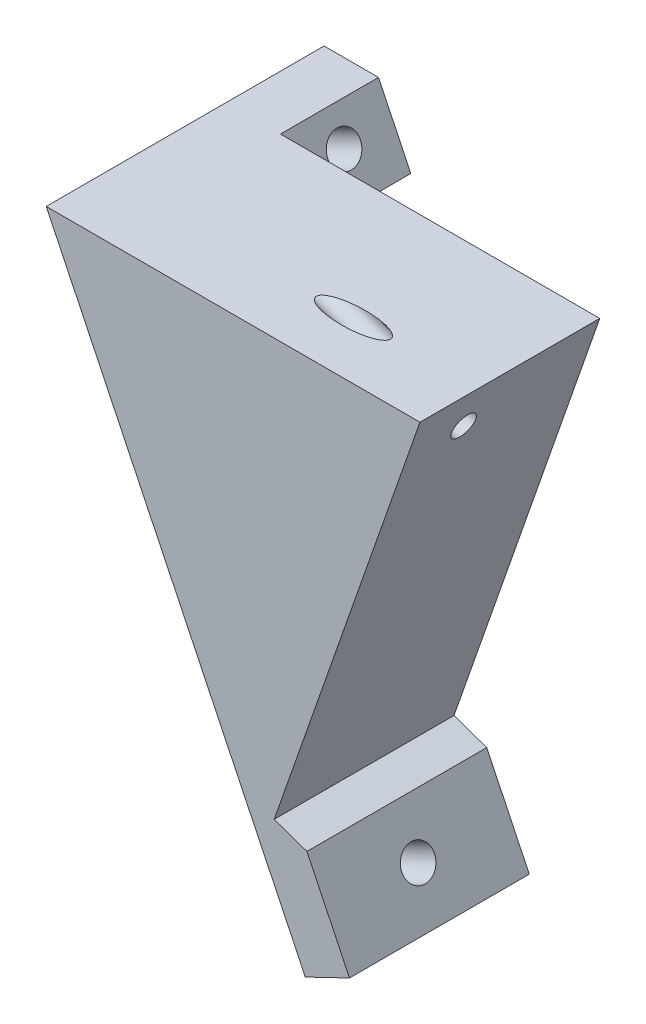
ISO-10303-21;
HEADER;
FILE_DESCRIPTION(('STEP AP214'),'2;1');
FILE_NAME('part.step','',(''),(''),'','','');
FILE_SCHEMA(('AUTOMOTIVE_DESIGN { 1 0 10303 214 1 1 1 1 }'));
ENDSEC;
DATA;
#1=APPLICATION_CONTEXT('core data for automotive mechanical design processes');
#2=APPLICATION_PROTOCOL_DEFINITION('international standard','automotive_design',2000,#1);
#3=PRODUCT_CONTEXT('',#1,'mechanical');
#4=PRODUCT('Part','Part','',(#3));
#5=PRODUCT_RELATED_PRODUCT_CATEGORY('part','',(#4));
#6=PRODUCT_DEFINITION_FORMATION('','',#4);
#7=PRODUCT_DEFINITION_CONTEXT('part definition',#1,'design');
#8=PRODUCT_DEFINITION('design','',#6,#7);
#9=PRODUCT_DEFINITION_SHAPE('','',#8);
#10=(LENGTH_UNIT() NAMED_UNIT(*) SI_UNIT(.MILLI.,.METRE.));
#11=(NAMED_UNIT(*) PLANE_ANGLE_UNIT() SI_UNIT($,.RADIAN.));
#12=(NAMED_UNIT(*) SI_UNIT($,.STERADIAN.) SOLID_ANGLE_UNIT());
#13=UNCERTAINTY_MEASURE_WITH_UNIT(LENGTH_MEASURE(1.E-05),#10,'distance_accuracy_value','');
#14=(GEOMETRIC_REPRESENTATION_CONTEXT(3) GLOBAL_UNCERTAINTY_ASSIGNED_CONTEXT((#13)) GLOBAL_UNIT_ASSIGNED_CONTEXT((#10,
#11,#12)) REPRESENTATION_CONTEXT('',''));
#15=CARTESIAN_POINT('',(0.,0.,0.));
#16=DIRECTION('',(0.,0.,1.));
#17=DIRECTION('',(1.,0.,0.));
#18=AXIS2_PLACEMENT_3D('',#15,#16,#17);
#19=CARTESIAN_POINT('',(9.49412369630558,24.241346542851,22.));
#20=DIRECTION('',(0.,-1.,0.));
#21=DIRECTION('',(0.,0.,-1.));
#22=AXIS2_PLACEMENT_3D('',#19,#20,#21);
#23=PLANE('',#22);
#24=CARTESIAN_POINT('',(-5.65051296153795,24.241346542851,15.));
#25=DIRECTION('',(0.,-1.,0.));
#26=DIRECTION('',(1.,0.,0.));
#27=AXIS2_PLACEMENT_3D('',#24,#25,#26);
#28=ELLIPSE('',#27,4.54339099735307,1.5);
#29=CARTESIAN_POINT('',(-1.10712196418488,24.241346542851,15.));
#30=VERTEX_POINT('',#29);
#31=EDGE_CURVE('E188',#30,#30,#28,.T.);
#32=ORIENTED_EDGE('',*,*,#31,.T.);
#33=EDGE_LOOP('',(#32));
#34=FACE_BOUND('',#33,.T.);
#35=DIRECTION('',(-1.,0.,0.));
#36=VECTOR('',#35,1.);
#37=CARTESIAN_POINT('',(9.49412369630558,24.241346542851,0.));
#38=LINE('',#37,#36);
#39=CARTESIAN_POINT('',(9.49412369630558,24.241346542851,0.));
#40=VERTEX_POINT('',#39);
#41=CARTESIAN_POINT('',(-29.578701160511,24.241346542851,0.));
#42=VERTEX_POINT('',#41);
#43=EDGE_CURVE('E135',#40,#42,#38,.T.);
#44=ORIENTED_EDGE('',*,*,#43,.T.);
#45=DIRECTION('',(0.,0.,-1.));
#46=VECTOR('',#45,1.);
#47=CARTESIAN_POINT('',(-29.578701160511,24.241346542851,0.));
#48=LINE('',#47,#46);
#49=CARTESIAN_POINT('',(-29.578701160511,24.241346542851,-12.));
#50=VERTEX_POINT('',#49);
#51=EDGE_CURVE('E11',#42,#50,#48,.T.);
#52=ORIENTED_EDGE('',*,*,#51,.T.);
#53=DIRECTION('',(-1.,0.,0.));
#54=VECTOR('',#53,1.);
#55=CARTESIAN_POINT('',(-30.8331808679364,24.241346542851,-12.));
#56=LINE('',#55,#54);
#57=CARTESIAN_POINT('',(-36.2386377440524,24.241346542851,-12.));
#58=VERTEX_POINT('',#57);
#59=EDGE_CURVE('E114',#50,#58,#56,.T.);
#60=ORIENTED_EDGE('',*,*,#59,.T.);
#61=DIRECTION('',(0.,0.,-1.));
#62=VECTOR('',#61,1.);
#63=CARTESIAN_POINT('',(-36.2386377440524,24.241346542851,22.));
#64=LINE('',#63,#62);
#65=CARTESIAN_POINT('',(-36.2386377440524,24.241346542851,22.));
#66=VERTEX_POINT('',#65);
#67=EDGE_CURVE('E40',#66,#58,#64,.T.);
#68=ORIENTED_EDGE('',*,*,#67,.F.);
#69=DIRECTION('',(-1.,0.,0.));
#70=VECTOR('',#69,1.);
#71=CARTESIAN_POINT('',(9.49412369630558,24.241346542851,22.));
#72=LINE('',#71,#70);
#73=CARTESIAN_POINT('',(9.49412369630558,24.241346542851,22.));
#74=VERTEX_POINT('',#73);
#75=EDGE_CURVE('E137',#74,#66,#72,.T.);
#76=ORIENTED_EDGE('',*,*,#75,.F.);
#77=DIRECTION('',(0.,0.,-1.));
#78=VECTOR('',#77,1.);
#79=CARTESIAN_POINT('',(9.49412369630558,24.241346542851,22.));
#80=LINE('',#79,#78);
#81=EDGE_CURVE('E112',#74,#40,#80,.T.);
#82=ORIENTED_EDGE('',*,*,#81,.T.);
#83=EDGE_LOOP('',(#44,#52,#60,#68,#76,#82));
#84=FACE_BOUND('',#83,.T.);
#85=ADVANCED_FACE('F33',(#34,#84),#23,.F.);
#86=CARTESIAN_POINT('',(-36.2386377440524,24.241346542851,22.));
#87=DIRECTION('',(0.900909479352666,0.434007039127834,0.));
#88=DIRECTION('',(-0.434007039127834,0.900909479352666,0.));
#89=AXIS2_PLACEMENT_3D('',#86,#87,#88);
#90=PLANE('',#89);
#91=CARTESIAN_POINT('',(-33.2005884701575,17.9349801873824,-6.));
#92=DIRECTION('',(0.900909479352665,0.434007039127834,0.));
#93=DIRECTION('',(-0.434007039127834,0.900909479352665,0.));
#94=AXIS2_PLACEMENT_3D('',#91,#92,#93);
#95=CIRCLE('',#94,2.);
#96=CARTESIAN_POINT('',(-34.0686025484132,19.7367991460877,-6.));
#97=VERTEX_POINT('',#96);
#98=EDGE_CURVE('E176',#97,#97,#95,.T.);
#99=ORIENTED_EDGE('',*,*,#98,.T.);
#100=EDGE_LOOP('',(#99));
#101=FACE_BOUND('',#100,.T.);
#102=CARTESIAN_POINT('',(-7.13871806643441,-36.164110333265,11.));
#103=DIRECTION('',(0.900909479352665,0.434007039127834,0.));
#104=DIRECTION('',(-0.434007039127834,0.900909479352665,0.));
#105=AXIS2_PLACEMENT_3D('',#102,#103,#104);
#106=CIRCLE('',#105,2.);
#107=CARTESIAN_POINT('',(-8.00673214469008,-34.3622913745596,11.));
#108=VERTEX_POINT('',#107);
#109=EDGE_CURVE('E187',#108,#108,#106,.T.);
#110=ORIENTED_EDGE('',*,*,#109,.T.);
#111=EDGE_LOOP('',(#110));
#112=FACE_BOUND('',#111,.T.);
#113=ORIENTED_EDGE('',*,*,#67,.T.);
#114=DIRECTION('',(0.434007039127834,-0.900909479352665,0.));
#115=VECTOR('',#114,1.);
#116=CARTESIAN_POINT('',(-36.2386377440524,24.241346542851,-12.));
#117=LINE('',#116,#115);
#118=CARTESIAN_POINT('',(-31.0305532745184,13.4304327906191,-12.));
#119=VERTEX_POINT('',#118);
#120=EDGE_CURVE('E105',#58,#119,#117,.T.);
#121=ORIENTED_EDGE('',*,*,#120,.T.);
#122=DIRECTION('',(0.,0.,1.));
#123=VECTOR('',#122,1.);
#124=CARTESIAN_POINT('',(-31.0305532745184,13.4304327906191,0.));
#125=LINE('',#124,#123);
#126=CARTESIAN_POINT('',(-31.0305532745184,13.4304327906191,0.));
#127=VERTEX_POINT('',#126);
#128=EDGE_CURVE('E122',#119,#127,#125,.T.);
#129=ORIENTED_EDGE('',*,*,#128,.T.);
#130=DIRECTION('',(0.434007039127834,-0.900909479352665,0.));
#131=VECTOR('',#130,1.);
#132=CARTESIAN_POINT('',(-36.2386377440524,24.241346542851,0.));
#133=LINE('',#132,#131);
#134=CARTESIAN_POINT('',(-4.53467583166741,-41.5695672093809,0.));
#135=VERTEX_POINT('',#134);
#136=EDGE_CURVE('E144',#127,#135,#133,.T.);
#137=ORIENTED_EDGE('',*,*,#136,.T.);
#138=DIRECTION('',(0.,0.,1.));
#139=VECTOR('',#138,1.);
#140=CARTESIAN_POINT('',(-4.53467583166741,-41.5695672093809,0.));
#141=LINE('',#140,#139);
#142=CARTESIAN_POINT('',(-4.53467583166741,-41.5695672093809,22.));
#143=VERTEX_POINT('',#142);
#144=EDGE_CURVE('E173',#135,#143,#141,.T.);
#145=ORIENTED_EDGE('',*,*,#144,.T.);
#146=DIRECTION('',(0.434007039127834,-0.900909479352665,0.));
#147=VECTOR('',#146,1.);
#148=CARTESIAN_POINT('',(-36.2386377440524,24.241346542851,22.));
#149=LINE('',#148,#147);
#150=EDGE_CURVE('E108',#66,#143,#149,.T.);
#151=ORIENTED_EDGE('',*,*,#150,.F.);
#152=EDGE_LOOP('',(#113,#121,#129,#137,#145,#151));
#153=FACE_BOUND('',#152,.T.);
#154=ADVANCED_FACE('F102',(#101,#112,#153),#90,.F.);
#155=CARTESIAN_POINT('',(-9.74276030120141,-30.758653457149,22.));
#156=DIRECTION('',(-0.9439285225355,0.33014988163552,0.));
#157=DIRECTION('',(-0.33014988163552,-0.9439285225355,0.));
#158=AXIS2_PLACEMENT_3D('',#155,#156,#157);
#159=PLANE('',#158);
#160=CARTESIAN_POINT('',(7.84337428812798,19.5217039301735,15.));
#161=DIRECTION('',(0.9439285225355,-0.33014988163552,0.));
#162=DIRECTION('',(0.33014988163552,0.9439285225355,0.));
#163=AXIS2_PLACEMENT_3D('',#160,#161,#162);
#164=CIRCLE('',#163,1.5);
#165=CARTESIAN_POINT('',(8.33859911058126,20.9375967139768,15.));
#166=VERTEX_POINT('',#165);
#167=EDGE_CURVE('E117',#166,#166,#164,.T.);
#168=ORIENTED_EDGE('',*,*,#167,.F.);
#169=EDGE_LOOP('',(#168));
#170=FACE_BOUND('',#169,.T.);
#171=DIRECTION('',(0.33014988163552,0.9439285225355,0.));
#172=VECTOR('',#171,1.);
#173=CARTESIAN_POINT('',(-9.74276030120141,-30.758653457149,22.));
#174=LINE('',#173,#172);
#175=CARTESIAN_POINT('',(-8.34308333133661,-26.7568497683322,22.));
#176=VERTEX_POINT('',#175);
#177=EDGE_CURVE('E141',#176,#74,#174,.T.);
#178=ORIENTED_EDGE('',*,*,#177,.F.);
#179=DIRECTION('',(0.,0.,-1.));
#180=VECTOR('',#179,1.);
#181=CARTESIAN_POINT('',(-8.34308333133661,-26.7568497683322,22.));
#182=LINE('',#181,#180);
#183=CARTESIAN_POINT('',(-8.34308333133661,-26.7568497683322,0.));
#184=VERTEX_POINT('',#183);
#185=EDGE_CURVE('E127',#176,#184,#182,.T.);
#186=ORIENTED_EDGE('',*,*,#185,.T.);
#187=DIRECTION('',(0.33014988163552,0.9439285225355,0.));
#188=VECTOR('',#187,1.);
#189=CARTESIAN_POINT('',(-9.74276030120141,-30.758653457149,0.));
#190=LINE('',#189,#188);
#191=EDGE_CURVE('E139',#184,#40,#190,.T.);
#192=ORIENTED_EDGE('',*,*,#191,.T.);
#193=ORIENTED_EDGE('',*,*,#81,.F.);
#194=EDGE_LOOP('',(#178,#186,#192,#193));
#195=FACE_BOUND('',#194,.T.);
#196=ADVANCED_FACE('F204',(#170,#195),#159,.F.);
#197=CARTESIAN_POINT('',(0.,0.,22.));
#198=DIRECTION('',(0.,0.,-1.));
#199=DIRECTION('',(-1.,0.,0.));
#200=AXIS2_PLACEMENT_3D('',#197,#198,#199);
#201=PLANE('',#200);
#202=ORIENTED_EDGE('',*,*,#75,.T.);
#203=ORIENTED_EDGE('',*,*,#150,.T.);
#204=DIRECTION('',(-0.900909479352665,-0.434007039127834,0.));
#205=VECTOR('',#204,1.);
#206=CARTESIAN_POINT('',(0.870781044448587,-38.9655249746139,22.));
#207=LINE('',#206,#205);
#208=CARTESIAN_POINT('',(0.870781044448587,-38.9655249746139,22.));
#209=VERTEX_POINT('',#208);
#210=EDGE_CURVE('E165',#209,#143,#207,.T.);
#211=ORIENTED_EDGE('',*,*,#210,.F.);
#212=DIRECTION('',(-0.434007039127834,0.900909479352665,0.));
#213=VECTOR('',#212,1.);
#214=CARTESIAN_POINT('',(-4.33730342508542,-28.154611222382,22.));
#215=LINE('',#214,#213);
#216=CARTESIAN_POINT('',(-4.33730342508542,-28.154611222382,22.));
#217=VERTEX_POINT('',#216);
#218=EDGE_CURVE('E170',#209,#217,#215,.T.);
#219=ORIENTED_EDGE('',*,*,#218,.T.);
#220=DIRECTION('',(0.944171123106107,-0.329455445079532,0.));
#221=VECTOR('',#220,1.);
#222=CARTESIAN_POINT('',(-4.33730342508542,-28.154611222382,22.));
#223=LINE('',#222,#221);
#224=EDGE_CURVE('E162',#176,#217,#223,.T.);
#225=ORIENTED_EDGE('',*,*,#224,.F.);
#226=ORIENTED_EDGE('',*,*,#177,.T.);
#227=EDGE_LOOP('',(#202,#203,#211,#219,#225,#226));
#228=FACE_BOUND('',#227,.T.);
#229=ADVANCED_FACE('F206',(#228),#201,.F.);
#230=CARTESIAN_POINT('',(0.,0.,0.));
#231=DIRECTION('',(0.,0.,-1.));
#232=DIRECTION('',(-1.,0.,0.));
#233=AXIS2_PLACEMENT_3D('',#230,#231,#232);
#234=PLANE('',#233);
#235=DIRECTION('',(-0.900909479352665,-0.434007039127834,0.));
#236=VECTOR('',#235,1.);
#237=CARTESIAN_POINT('',(-25.6250963984024,16.0344750253861,0.));
#238=LINE('',#237,#236);
#239=CARTESIAN_POINT('',(-25.6250963984024,16.0344750253861,0.));
#240=VERTEX_POINT('',#239);
#241=EDGE_CURVE('E133',#240,#127,#238,.T.);
#242=ORIENTED_EDGE('',*,*,#241,.F.);
#243=DIRECTION('',(-0.434007039127834,0.900909479352665,0.));
#244=VECTOR('',#243,1.);
#245=CARTESIAN_POINT('',(-30.8331808679364,26.8453887776181,0.));
#246=LINE('',#245,#244);
#247=EDGE_CURVE('E125',#240,#42,#246,.T.);
#248=ORIENTED_EDGE('',*,*,#247,.T.);
#249=ORIENTED_EDGE('',*,*,#43,.F.);
#250=ORIENTED_EDGE('',*,*,#191,.F.);
#251=DIRECTION('',(0.944171123106107,-0.329455445079532,0.));
#252=VECTOR('',#251,1.);
#253=CARTESIAN_POINT('',(-4.33730342508542,-28.154611222382,0.));
#254=LINE('',#253,#252);
#255=CARTESIAN_POINT('',(-4.33730342508542,-28.154611222382,0.));
#256=VERTEX_POINT('',#255);
#257=EDGE_CURVE('E47',#184,#256,#254,.T.);
#258=ORIENTED_EDGE('',*,*,#257,.T.);
#259=DIRECTION('',(0.434007039127834,-0.900909479352665,0.));
#260=VECTOR('',#259,1.);
#261=CARTESIAN_POINT('',(-4.33730342508542,-28.154611222382,0.));
#262=LINE('',#261,#260);
#263=CARTESIAN_POINT('',(0.870781044448587,-38.9655249746139,0.));
#264=VERTEX_POINT('',#263);
#265=EDGE_CURVE('E175',#256,#264,#262,.T.);
#266=ORIENTED_EDGE('',*,*,#265,.T.);
#267=DIRECTION('',(-0.900909479352665,-0.434007039127834,0.));
#268=VECTOR('',#267,1.);
#269=CARTESIAN_POINT('',(0.870781044448587,-38.9655249746139,0.));
#270=LINE('',#269,#268);
#271=EDGE_CURVE('E167',#264,#135,#270,.T.);
#272=ORIENTED_EDGE('',*,*,#271,.T.);
#273=ORIENTED_EDGE('',*,*,#136,.F.);
#274=EDGE_LOOP('',(#242,#248,#249,#250,#258,#266,#272,#273));
#275=FACE_BOUND('',#274,.T.);
#276=ADVANCED_FACE('F155',(#275),#234,.T.);
#277=CARTESIAN_POINT('',(-25.6250963984024,16.0344750253861,0.));
#278=DIRECTION('',(0.434007039127834,-0.900909479352665,0.));
#279=DIRECTION('',(0.900909479352665,0.434007039127834,0.));
#280=AXIS2_PLACEMENT_3D('',#277,#278,#279);
#281=PLANE('',#280);
#282=ORIENTED_EDGE('',*,*,#128,.F.);
#283=DIRECTION('',(-0.900909479352665,-0.434007039127834,0.));
#284=VECTOR('',#283,1.);
#285=CARTESIAN_POINT('',(-25.6250963984024,16.0344750253861,-12.));
#286=LINE('',#285,#284);
#287=CARTESIAN_POINT('',(-25.6250963984024,16.0344750253861,-12.));
#288=VERTEX_POINT('',#287);
#289=EDGE_CURVE('E121',#288,#119,#286,.T.);
#290=ORIENTED_EDGE('',*,*,#289,.F.);
#291=DIRECTION('',(0.,0.,1.));
#292=VECTOR('',#291,1.);
#293=CARTESIAN_POINT('',(-25.6250963984024,16.0344750253861,0.));
#294=LINE('',#293,#292);
#295=EDGE_CURVE('E130',#288,#240,#294,.T.);
#296=ORIENTED_EDGE('',*,*,#295,.T.);
#297=ORIENTED_EDGE('',*,*,#241,.T.);
#298=EDGE_LOOP('',(#282,#290,#296,#297));
#299=FACE_BOUND('',#298,.T.);
#300=ADVANCED_FACE('F221',(#299),#281,.T.);
#301=CARTESIAN_POINT('',(-30.8331808679364,26.8453887776181,-12.));
#302=DIRECTION('',(0.,0.,-1.));
#303=DIRECTION('',(0.,1.,0.));
#304=AXIS2_PLACEMENT_3D('',#301,#302,#303);
#305=PLANE('',#304);
#306=ORIENTED_EDGE('',*,*,#59,.F.);
#307=DIRECTION('',(0.434007039127834,-0.900909479352665,0.));
#308=VECTOR('',#307,1.);
#309=CARTESIAN_POINT('',(-30.8331808679364,26.8453887776181,-12.));
#310=LINE('',#309,#308);
#311=EDGE_CURVE('E159',#50,#288,#310,.T.);
#312=ORIENTED_EDGE('',*,*,#311,.T.);
#313=ORIENTED_EDGE('',*,*,#289,.T.);
#314=ORIENTED_EDGE('',*,*,#120,.F.);
#315=EDGE_LOOP('',(#306,#312,#313,#314));
#316=FACE_BOUND('',#315,.T.);
#317=ADVANCED_FACE('F119',(#316),#305,.T.);
#318=CARTESIAN_POINT('',(-14.5288025097088,-6.99915219433874,0.));
#319=DIRECTION('',(0.900909479352665,0.434007039127834,0.));
#320=DIRECTION('',(-0.434007039127834,0.900909479352665,0.));
#321=AXIS2_PLACEMENT_3D('',#318,#319,#320);
#322=PLANE('',#321);
#323=ORIENTED_EDGE('',*,*,#51,.F.);
#324=ORIENTED_EDGE('',*,*,#247,.F.);
#325=ORIENTED_EDGE('',*,*,#295,.F.);
#326=ORIENTED_EDGE('',*,*,#311,.F.);
#327=EDGE_LOOP('',(#323,#324,#325,#326));
#328=FACE_BOUND('',#327,.T.);
#329=CARTESIAN_POINT('',(-27.7951315940415,20.5390224221494,-6.));
#330=DIRECTION('',(0.900909479352665,0.434007039127834,0.));
#331=DIRECTION('',(-0.434007039127834,0.900909479352665,0.));
#332=AXIS2_PLACEMENT_3D('',#329,#330,#331);
#333=CIRCLE('',#332,2.);
#334=CARTESIAN_POINT('',(-28.6631456722972,22.3408413808547,-6.));
#335=VERTEX_POINT('',#334);
#336=EDGE_CURVE('E191',#335,#335,#333,.T.);
#337=ORIENTED_EDGE('',*,*,#336,.F.);
#338=EDGE_LOOP('',(#337));
#339=FACE_BOUND('',#338,.T.);
#340=ADVANCED_FACE('F222',(#328,#339),#322,.T.);
#341=CARTESIAN_POINT('',(-4.33730342508542,-28.154611222382,22.));
#342=DIRECTION('',(0.329455445079532,0.944171123106107,0.));
#343=DIRECTION('',(-0.944171123106107,0.329455445079532,0.));
#344=AXIS2_PLACEMENT_3D('',#341,#342,#343);
#345=PLANE('',#344);
#346=ORIENTED_EDGE('',*,*,#257,.F.);
#347=ORIENTED_EDGE('',*,*,#185,.F.);
#348=ORIENTED_EDGE('',*,*,#224,.T.);
#349=DIRECTION('',(0.,0.,-1.));
#350=VECTOR('',#349,1.);
#351=CARTESIAN_POINT('',(-4.33730342508542,-28.154611222382,22.));
#352=LINE('',#351,#350);
#353=EDGE_CURVE('E123',#217,#256,#352,.T.);
#354=ORIENTED_EDGE('',*,*,#353,.T.);
#355=EDGE_LOOP('',(#346,#347,#348,#354));
#356=FACE_BOUND('',#355,.T.);
#357=ADVANCED_FACE('F212',(#356),#345,.T.);
#358=CARTESIAN_POINT('',(0.870781044448587,-38.9655249746139,0.));
#359=DIRECTION('',(0.434007039127834,-0.900909479352665,0.));
#360=DIRECTION('',(0.900909479352665,0.434007039127834,0.));
#361=AXIS2_PLACEMENT_3D('',#358,#359,#360);
#362=PLANE('',#361);
#363=ORIENTED_EDGE('',*,*,#144,.F.);
#364=ORIENTED_EDGE('',*,*,#271,.F.);
#365=DIRECTION('',(0.,0.,1.));
#366=VECTOR('',#365,1.);
#367=CARTESIAN_POINT('',(0.870781044448587,-38.9655249746139,0.));
#368=LINE('',#367,#366);
#369=EDGE_CURVE('E179',#264,#209,#368,.T.);
#370=ORIENTED_EDGE('',*,*,#369,.T.);
#371=ORIENTED_EDGE('',*,*,#210,.T.);
#372=EDGE_LOOP('',(#363,#364,#370,#371));
#373=FACE_BOUND('',#372,.T.);
#374=ADVANCED_FACE('F219',(#373),#362,.T.);
#375=CARTESIAN_POINT('',(-14.5288025097088,-6.99915219433874,0.));
#376=DIRECTION('',(-0.900909479352665,-0.434007039127834,0.));
#377=DIRECTION('',(0.434007039127834,-0.900909479352665,0.));
#378=AXIS2_PLACEMENT_3D('',#375,#376,#377);
#379=PLANE('',#378);
#380=CARTESIAN_POINT('',(-1.73326119031842,-33.560068098498,11.));
#381=DIRECTION('',(0.900909479352665,0.434007039127834,0.));
#382=DIRECTION('',(-0.434007039127834,0.900909479352665,0.));
#383=AXIS2_PLACEMENT_3D('',#380,#381,#382);
#384=CIRCLE('',#383,2.);
#385=CARTESIAN_POINT('',(-2.60127526857409,-31.7582491397926,11.));
#386=VERTEX_POINT('',#385);
#387=EDGE_CURVE('E184',#386,#386,#384,.T.);
#388=ORIENTED_EDGE('',*,*,#387,.F.);
#389=EDGE_LOOP('',(#388));
#390=FACE_BOUND('',#389,.T.);
#391=ORIENTED_EDGE('',*,*,#265,.F.);
#392=ORIENTED_EDGE('',*,*,#353,.F.);
#393=ORIENTED_EDGE('',*,*,#218,.F.);
#394=ORIENTED_EDGE('',*,*,#369,.F.);
#395=EDGE_LOOP('',(#391,#392,#393,#394));
#396=FACE_BOUND('',#395,.T.);
#397=ADVANCED_FACE('F216',(#390,#396),#379,.F.);
#398=CARTESIAN_POINT('',(-7.13871806643441,-36.164110333265,11.));
#399=DIRECTION('',(0.900909479352665,0.434007039127834,0.));
#400=DIRECTION('',(-0.434007039127834,0.900909479352665,0.));
#401=AXIS2_PLACEMENT_3D('',#398,#399,#400);
#402=CYLINDRICAL_SURFACE('',#401,2.);
#403=CARTESIAN_POINT('',(-8.00673214469008,-34.3622913745596,11.));
#404=CARTESIAN_POINT('',(-7.95042530223054,-34.3351659346141,11.));
#405=CARTESIAN_POINT('',(-7.894118459771,-34.3080404946686,11.));
#406=CARTESIAN_POINT('',(-7.78150477485191,-34.2537896147777,11.));
#407=CARTESIAN_POINT('',(-7.72519793239237,-34.2266641748322,11.));
#408=CARTESIAN_POINT('',(-7.61258424747329,-34.1724132949412,11.));
#409=CARTESIAN_POINT('',(-7.55627740501375,-34.1452878549957,11.));
#410=CARTESIAN_POINT('',(-7.44366372009467,-34.0910369751047,11.));
#411=CARTESIAN_POINT('',(-7.38735687763512,-34.0639115351592,11.));
#412=CARTESIAN_POINT('',(-7.27474319271604,-34.0096606552683,11.));
#413=CARTESIAN_POINT('',(-7.2184363502565,-33.9825352153228,11.));
#414=CARTESIAN_POINT('',(-7.10582266533742,-33.9282843354318,11.));
#415=CARTESIAN_POINT('',(-7.04951582287787,-33.9011588954863,11.));
#416=CARTESIAN_POINT('',(-6.93690213795879,-33.8469080155953,11.));
#417=CARTESIAN_POINT('',(-6.88059529549925,-33.8197825756498,11.));
#418=CARTESIAN_POINT('',(-6.76798161058017,-33.7655316957588,11.));
#419=CARTESIAN_POINT('',(-6.71167476812063,-33.7384062558134,11.));
#420=CARTESIAN_POINT('',(-6.59906108320154,-33.6841553759224,11.));
#421=CARTESIAN_POINT('',(-6.542754240742,-33.6570299359769,11.));
#422=CARTESIAN_POINT('',(-6.43014055582292,-33.6027790560859,11.));
#423=CARTESIAN_POINT('',(-6.37383371336337,-33.5756536161404,11.));
#424=CARTESIAN_POINT('',(-6.26122002844429,-33.5214027362494,11.));
#425=CARTESIAN_POINT('',(-6.20491318598475,-33.4942772963039,11.));
#426=CARTESIAN_POINT('',(-6.09229950106567,-33.440026416413,11.));
#427=CARTESIAN_POINT('',(-6.03599265860613,-33.4129009764675,11.));
#428=CARTESIAN_POINT('',(-5.92337897368704,-33.3586500965765,11.));
#429=CARTESIAN_POINT('',(-5.8670721312275,-33.331524656631,11.));
#430=CARTESIAN_POINT('',(-5.75445844630842,-33.27727377674,11.));
#431=CARTESIAN_POINT('',(-5.69815160384888,-33.2501483367946,11.));
#432=CARTESIAN_POINT('',(-5.58553791892979,-33.1958974569036,11.));
#433=CARTESIAN_POINT('',(-5.52923107647025,-33.1687720169581,11.));
#434=CARTESIAN_POINT('',(-5.41661739155117,-33.1145211370671,11.));
#435=CARTESIAN_POINT('',(-5.36031054909163,-33.0873956971216,11.));
#436=CARTESIAN_POINT('',(-5.24769686417254,-33.0331448172306,11.));
#437=CARTESIAN_POINT('',(-5.191390021713,-33.0060193772851,11.));
#438=CARTESIAN_POINT('',(-5.07877633679392,-32.9517684973942,11.));
#439=CARTESIAN_POINT('',(-5.02246949433438,-32.9246430574487,11.));
#440=CARTESIAN_POINT('',(-4.90985580941529,-32.8703921775577,11.));
#441=CARTESIAN_POINT('',(-4.85354896695575,-32.8432667376122,11.));
#442=CARTESIAN_POINT('',(-4.74093528203667,-32.7890158577212,11.));
#443=CARTESIAN_POINT('',(-4.68462843957713,-32.7618904177757,11.));
#444=CARTESIAN_POINT('',(-4.57201475465804,-32.7076395378848,11.));
#445=CARTESIAN_POINT('',(-4.5157079121985,-32.6805140979393,11.));
#446=CARTESIAN_POINT('',(-4.40309422727942,-32.6262632180483,11.));
#447=CARTESIAN_POINT('',(-4.34678738481988,-32.5991377781028,11.));
#448=CARTESIAN_POINT('',(-4.2341736999008,-32.5448868982118,11.));
#449=CARTESIAN_POINT('',(-4.17786685744125,-32.5177614582663,11.));
#450=CARTESIAN_POINT('',(-4.06525317252217,-32.4635105783753,11.));
#451=CARTESIAN_POINT('',(-4.00894633006263,-32.4363851384299,11.));
#452=CARTESIAN_POINT('',(-3.89633264514355,-32.3821342585389,11.));
#453=CARTESIAN_POINT('',(-3.840025802684,-32.3550088185934,11.));
#454=CARTESIAN_POINT('',(-3.72741211776492,-32.3007579387024,11.));
#455=CARTESIAN_POINT('',(-3.67110527530538,-32.2736324987569,11.));
#456=CARTESIAN_POINT('',(-3.5584915903863,-32.2193816188659,11.));
#457=CARTESIAN_POINT('',(-3.50218474792675,-32.1922561789205,11.));
#458=CARTESIAN_POINT('',(-3.38957106300767,-32.1380052990295,11.));
#459=CARTESIAN_POINT('',(-3.33326422054813,-32.110879859084,11.));
#460=CARTESIAN_POINT('',(-3.22065053562905,-32.056628979193,11.));
#461=CARTESIAN_POINT('',(-3.1643436931695,-32.0295035392475,11.));
#462=CARTESIAN_POINT('',(-3.05173000825042,-31.9752526593565,11.));
#463=CARTESIAN_POINT('',(-2.99542316579088,-31.948127219411,11.));
#464=CARTESIAN_POINT('',(-2.8828094808718,-31.8938763395201,11.));
#465=CARTESIAN_POINT('',(-2.82650263841226,-31.8667508995746,11.));
#466=CARTESIAN_POINT('',(-2.71388895349317,-31.8125000196836,11.));
#467=CARTESIAN_POINT('',(-2.65758211103363,-31.7853745797381,11.));
#468=CARTESIAN_POINT('',(-2.60127526857409,-31.7582491397926,11.));
#469=B_SPLINE_CURVE_WITH_KNOTS('',3,(#403,#404,#405,#406,#407,#408,#409,#410,#411,#412,#413,
#414,#415,#416,#417,#418,#419,#420,#421,#422,#423,#424,#425,#426,#427,#428,#429,#430,#431,#432,
#433,#434,#435,#436,#437,#438,#439,#440,#441,#442,#443,#444,#445,#446,#447,#448,#449,#450,#451,
#452,#453,#454,#455,#456,#457,#458,#459,#460,#461,#462,#463,#464,#465,#466,#467,#468),
.UNSPECIFIED.,.F.,.F.,(4,2,2,2,2,2,2,2,2,2,2,2,2,2,2,2,2,2,2,2,2,2,2,2,2,2,2,2,2,2,2,2,4),(0.,
0.187500000000002,0.374999999999999,0.5625,0.750000000000002,0.937499999999999,1.125,1.3125,1.5,
1.6875,1.875,2.0625,2.25,2.4375,2.625,2.8125,3.,3.1875,3.375,3.5625,3.75,3.9375,4.125,4.3125,
4.5,4.6875,4.875,5.0625,5.25,5.4375,5.625,5.8125,6.),.UNSPECIFIED.);
#470=EDGE_CURVE('BSEAM230',#108,#386,#469,.T.);
#471=ORIENTED_EDGE('',*,*,#109,.F.);
#472=ORIENTED_EDGE('',*,*,#387,.T.);
#473=ORIENTED_EDGE('',*,*,#470,.T.);
#474=ORIENTED_EDGE('',*,*,#470,.F.);
#475=EDGE_LOOP('',(#471,#473,#472,#474));
#476=FACE_BOUND('',#475,.T.);
#477=ADVANCED_FACE('F230',(#476),#402,.F.);
#478=CARTESIAN_POINT('',(-33.2005884701575,17.9349801873824,-6.));
#479=DIRECTION('',(0.900909479352665,0.434007039127834,0.));
#480=DIRECTION('',(-0.434007039127834,0.900909479352665,0.));
#481=AXIS2_PLACEMENT_3D('',#478,#479,#480);
#482=CYLINDRICAL_SURFACE('',#481,2.);
#483=CARTESIAN_POINT('',(-34.0686025484132,19.7367991460877,-6.));
#484=CARTESIAN_POINT('',(-34.0122957059537,19.7639245860332,-6.));
#485=CARTESIAN_POINT('',(-33.9559888634941,19.7910500259787,-6.));
#486=CARTESIAN_POINT('',(-33.843375178575,19.8453009058697,-6.));
#487=CARTESIAN_POINT('',(-33.7870683361155,19.8724263458152,-6.));
#488=CARTESIAN_POINT('',(-33.6744546511964,19.9266772257061,-6.));
#489=CARTESIAN_POINT('',(-33.6181478087369,19.9538026656516,-6.));
#490=CARTESIAN_POINT('',(-33.5055341238178,20.0080535455426,-6.));
#491=CARTESIAN_POINT('',(-33.4492272813583,20.0351789854881,-6.));
#492=CARTESIAN_POINT('',(-33.3366135964392,20.0894298653791,-6.));
#493=CARTESIAN_POINT('',(-33.2803067539796,20.1165553053246,-6.));
#494=CARTESIAN_POINT('',(-33.1676930690605,20.1708061852156,-6.));
#495=CARTESIAN_POINT('',(-33.111386226601,20.197931625161,-6.));
#496=CARTESIAN_POINT('',(-32.9987725416819,20.252182505052,-6.));
#497=CARTESIAN_POINT('',(-32.9424656992224,20.2793079449975,-6.));
#498=CARTESIAN_POINT('',(-32.8298520143033,20.3335588248885,-6.));
#499=CARTESIAN_POINT('',(-32.7735451718438,20.360684264834,-6.));
#500=CARTESIAN_POINT('',(-32.6609314869247,20.414935144725,-6.));
#501=CARTESIAN_POINT('',(-32.6046246444651,20.4420605846705,-6.));
#502=CARTESIAN_POINT('',(-32.4920109595461,20.4963114645614,-6.));
#503=CARTESIAN_POINT('',(-32.4357041170865,20.5234369045069,-6.));
#504=CARTESIAN_POINT('',(-32.3230904321674,20.5776877843979,-6.));
#505=CARTESIAN_POINT('',(-32.2667835897079,20.6048132243434,-6.));
#506=CARTESIAN_POINT('',(-32.1541699047888,20.6590641042344,-6.));
#507=CARTESIAN_POINT('',(-32.0978630623293,20.6861895441799,-6.));
#508=CARTESIAN_POINT('',(-31.9852493774102,20.7404404240708,-6.));
#509=CARTESIAN_POINT('',(-31.9289425349506,20.7675658640163,-6.));
#510=CARTESIAN_POINT('',(-31.8163288500315,20.8218167439073,-6.));
#511=CARTESIAN_POINT('',(-31.760022007572,20.8489421838528,-6.));
#512=CARTESIAN_POINT('',(-31.6474083226529,20.9031930637438,-6.));
#513=CARTESIAN_POINT('',(-31.5911014801934,20.9303185036893,-6.));
#514=CARTESIAN_POINT('',(-31.4784877952743,20.9845693835802,-6.));
#515=CARTESIAN_POINT('',(-31.4221809528148,21.0116948235257,-6.));
#516=CARTESIAN_POINT('',(-31.3095672678957,21.0659457034167,-6.));
#517=CARTESIAN_POINT('',(-31.2532604254361,21.0930711433622,-6.));
#518=CARTESIAN_POINT('',(-31.140646740517,21.1473220232532,-6.));
#519=CARTESIAN_POINT('',(-31.0843398980575,21.1744474631987,-6.));
#520=CARTESIAN_POINT('',(-30.9717262131384,21.2286983430896,-6.));
#521=CARTESIAN_POINT('',(-30.9154193706789,21.2558237830351,-6.));
#522=CARTESIAN_POINT('',(-30.8028056857598,21.3100746629261,-6.));
#523=CARTESIAN_POINT('',(-30.7464988433003,21.3372001028716,-6.));
#524=CARTESIAN_POINT('',(-30.6338851583812,21.3914509827626,-6.));
#525=CARTESIAN_POINT('',(-30.5775783159216,21.4185764227081,-6.));
#526=CARTESIAN_POINT('',(-30.4649646310025,21.4728273025991,-6.));
#527=CARTESIAN_POINT('',(-30.408657788543,21.4999527425445,-6.));
#528=CARTESIAN_POINT('',(-30.2960441036239,21.5542036224355,-6.));
#529=CARTESIAN_POINT('',(-30.2397372611644,21.581329062381,-6.));
#530=CARTESIAN_POINT('',(-30.1271235762453,21.635579942272,-6.));
#531=CARTESIAN_POINT('',(-30.0708167337858,21.6627053822175,-6.));
#532=CARTESIAN_POINT('',(-29.9582030488667,21.7169562621085,-6.));
#533=CARTESIAN_POINT('',(-29.9018962064071,21.744081702054,-6.));
#534=CARTESIAN_POINT('',(-29.7892825214881,21.7983325819449,-6.));
#535=CARTESIAN_POINT('',(-29.7329756790285,21.8254580218904,-6.));
#536=CARTESIAN_POINT('',(-29.6203619941094,21.8797089017814,-6.));
#537=CARTESIAN_POINT('',(-29.5640551516499,21.9068343417269,-6.));
#538=CARTESIAN_POINT('',(-29.4514414667308,21.9610852216179,-6.));
#539=CARTESIAN_POINT('',(-29.3951346242713,21.9882106615634,-6.));
#540=CARTESIAN_POINT('',(-29.2825209393522,22.0424615414543,-6.));
#541=CARTESIAN_POINT('',(-29.2262140968926,22.0695869813998,-6.));
#542=CARTESIAN_POINT('',(-29.1136004119736,22.1238378612908,-6.));
#543=CARTESIAN_POINT('',(-29.057293569514,22.1509633012363,-6.));
#544=CARTESIAN_POINT('',(-28.9446798845949,22.2052141811273,-6.));
#545=CARTESIAN_POINT('',(-28.8883730421354,22.2323396210728,-6.));
#546=CARTESIAN_POINT('',(-28.7757593572163,22.2865905009637,-6.));
#547=CARTESIAN_POINT('',(-28.7194525147568,22.3137159409092,-6.));
#548=CARTESIAN_POINT('',(-28.6631456722972,22.3408413808547,-6.));
#549=B_SPLINE_CURVE_WITH_KNOTS('',3,(#483,#484,#485,#486,#487,#488,#489,#490,#491,#492,#493,
#494,#495,#496,#497,#498,#499,#500,#501,#502,#503,#504,#505,#506,#507,#508,#509,#510,#511,#512,
#513,#514,#515,#516,#517,#518,#519,#520,#521,#522,#523,#524,#525,#526,#527,#528,#529,#530,#531,
#532,#533,#534,#535,#536,#537,#538,#539,#540,#541,#542,#543,#544,#545,#546,#547,#548),
.UNSPECIFIED.,.F.,.F.,(4,2,2,2,2,2,2,2,2,2,2,2,2,2,2,2,2,2,2,2,2,2,2,2,2,2,2,2,2,2,2,2,4),(0.,
0.187500000000005,0.375000000000003,0.562500000000002,0.750000000000006,0.937500000000005,1.125,
1.3125,1.50000000000001,1.6875,1.875,2.0625,2.25000000000001,2.4375,2.625,2.8125,
3.00000000000001,3.1875,3.375,3.5625,3.75,3.9375,4.125,4.3125,4.5,4.6875,4.875,5.0625,5.25,
5.4375,5.625,5.8125,6.),.UNSPECIFIED.);
#550=EDGE_CURVE('BSEAM228',#97,#335,#549,.T.);
#551=ORIENTED_EDGE('',*,*,#98,.F.);
#552=ORIENTED_EDGE('',*,*,#336,.T.);
#553=ORIENTED_EDGE('',*,*,#550,.T.);
#554=ORIENTED_EDGE('',*,*,#550,.F.);
#555=EDGE_LOOP('',(#551,#553,#552,#554));
#556=FACE_BOUND('',#555,.T.);
#557=ADVANCED_FACE('F228',(#556),#482,.F.);
#558=CARTESIAN_POINT('',(-26.13805252315,31.4070996690523,15.));
#559=DIRECTION('',(0.9439285225355,-0.33014988163552,0.));
#560=DIRECTION('',(0.33014988163552,0.9439285225355,0.));
#561=AXIS2_PLACEMENT_3D('',#558,#559,#560);
#562=CYLINDRICAL_SURFACE('',#561,1.5);
#563=ORIENTED_EDGE('',*,*,#167,.T.);
#564=EDGE_LOOP('',(#563));
#565=FACE_BOUND('',#564,.T.);
#566=ORIENTED_EDGE('',*,*,#31,.F.);
#567=EDGE_LOOP('',(#566));
#568=FACE_BOUND('',#567,.T.);
#569=ADVANCED_FACE('F201',(#565,#568),#562,.F.);
#570=CLOSED_SHELL('',(#85,#154,#196,#229,#276,#300,#317,#340,#357,#374,#397,#477,#557,#569));
#571=MANIFOLD_SOLID_BREP('B2',#570);
#572=ADVANCED_BREP_SHAPE_REPRESENTATION('',(#18,#571),#14);
#573=SHAPE_DEFINITION_REPRESENTATION(#9,#572);
ENDSEC;
END-ISO-10303-21;
